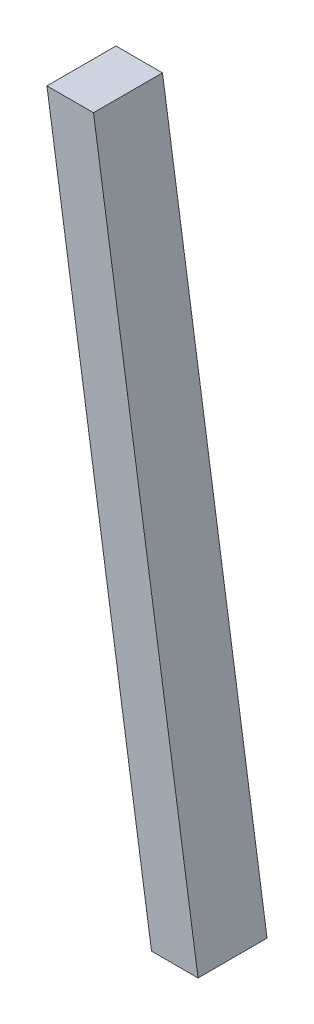
ISO-10303-21;
HEADER;
FILE_DESCRIPTION(('STEP AP214'),'2;1');
FILE_NAME('part.step','',(''),(''),'','','');
FILE_SCHEMA(('AUTOMOTIVE_DESIGN { 1 0 10303 214 1 1 1 1 }'));
ENDSEC;
DATA;
#1=APPLICATION_CONTEXT('core data for automotive mechanical design processes');
#2=APPLICATION_PROTOCOL_DEFINITION('international standard','automotive_design',2000,#1);
#3=PRODUCT_CONTEXT('',#1,'mechanical');
#4=PRODUCT('Part','Part','',(#3));
#5=PRODUCT_RELATED_PRODUCT_CATEGORY('part','',(#4));
#6=PRODUCT_DEFINITION_FORMATION('','',#4);
#7=PRODUCT_DEFINITION_CONTEXT('part definition',#1,'design');
#8=PRODUCT_DEFINITION('design','',#6,#7);
#9=PRODUCT_DEFINITION_SHAPE('','',#8);
#10=(LENGTH_UNIT() NAMED_UNIT(*) SI_UNIT(.MILLI.,.METRE.));
#11=(NAMED_UNIT(*) PLANE_ANGLE_UNIT() SI_UNIT($,.RADIAN.));
#12=(NAMED_UNIT(*) SI_UNIT($,.STERADIAN.) SOLID_ANGLE_UNIT());
#13=UNCERTAINTY_MEASURE_WITH_UNIT(LENGTH_MEASURE(1.E-05),#10,'distance_accuracy_value','');
#14=(GEOMETRIC_REPRESENTATION_CONTEXT(3) GLOBAL_UNCERTAINTY_ASSIGNED_CONTEXT((#13)) GLOBAL_UNIT_ASSIGNED_CONTEXT((#10,
#11,#12)) REPRESENTATION_CONTEXT('',''));
#15=CARTESIAN_POINT('',(0.,0.,0.));
#16=DIRECTION('',(0.,0.,1.));
#17=DIRECTION('',(1.,0.,0.));
#18=AXIS2_PLACEMENT_3D('',#15,#16,#17);
#19=CARTESIAN_POINT('',(140.921638906301,-777.794238257427,60.));
#20=DIRECTION('',(0.988936352868298,0.148340452930245,0.));
#21=DIRECTION('',(-0.148340452930245,0.988936352868298,0.));
#22=AXIS2_PLACEMENT_3D('',#19,#20,#21);
#23=PLANE('',#22);
#24=DIRECTION('',(0.148340452930245,-0.988936352868298,0.));
#25=VECTOR('',#24,1.);
#26=CARTESIAN_POINT('',(140.921638906301,-777.794238257427,0.));
#27=LINE('',#26,#25);
#28=CARTESIAN_POINT('',(24.2525031676866,0.,0.));
#29=VERTEX_POINT('',#28);
#30=CARTESIAN_POINT('',(115.152503167687,-606.,0.));
#31=VERTEX_POINT('',#30);
#32=EDGE_CURVE('E94',#29,#31,#27,.T.);
#33=ORIENTED_EDGE('',*,*,#32,.T.);
#34=DIRECTION('',(0.,0.,-1.));
#35=VECTOR('',#34,1.);
#36=CARTESIAN_POINT('',(115.152503167687,-606.,60.));
#37=LINE('',#36,#35);
#38=CARTESIAN_POINT('',(115.152503167687,-606.,60.));
#39=VERTEX_POINT('',#38);
#40=EDGE_CURVE('E11',#39,#31,#37,.T.);
#41=ORIENTED_EDGE('',*,*,#40,.F.);
#42=DIRECTION('',(0.148340452930245,-0.988936352868298,0.));
#43=VECTOR('',#42,1.);
#44=CARTESIAN_POINT('',(140.921638906301,-777.794238257427,60.));
#45=LINE('',#44,#43);
#46=CARTESIAN_POINT('',(24.2525031676866,0.,60.));
#47=VERTEX_POINT('',#46);
#48=EDGE_CURVE('E80',#47,#39,#45,.T.);
#49=ORIENTED_EDGE('',*,*,#48,.F.);
#50=DIRECTION('',(0.,0.,-1.));
#51=VECTOR('',#50,1.);
#52=CARTESIAN_POINT('',(24.2525031676866,0.,60.));
#53=LINE('',#52,#51);
#54=EDGE_CURVE('E47',#47,#29,#53,.T.);
#55=ORIENTED_EDGE('',*,*,#54,.T.);
#56=EDGE_LOOP('',(#33,#41,#49,#55));
#57=FACE_BOUND('',#56,.T.);
#58=ADVANCED_FACE('F31',(#57),#23,.F.);
#59=CARTESIAN_POINT('',(89.9262515838434,-606.,60.));
#60=DIRECTION('',(0.,1.,0.));
#61=DIRECTION('',(0.,0.,1.));
#62=AXIS2_PLACEMENT_3D('',#59,#60,#61);
#63=PLANE('',#62);
#64=DIRECTION('',(1.,0.,0.));
#65=VECTOR('',#64,1.);
#66=CARTESIAN_POINT('',(89.9262515838434,-606.,0.));
#67=LINE('',#66,#65);
#68=CARTESIAN_POINT('',(155.6,-606.,0.));
#69=VERTEX_POINT('',#68);
#70=EDGE_CURVE('E85',#31,#69,#67,.T.);
#71=ORIENTED_EDGE('',*,*,#70,.T.);
#72=DIRECTION('',(0.,0.,-1.));
#73=VECTOR('',#72,1.);
#74=CARTESIAN_POINT('',(155.6,-606.,60.));
#75=LINE('',#74,#73);
#76=CARTESIAN_POINT('',(155.6,-606.,60.));
#77=VERTEX_POINT('',#76);
#78=EDGE_CURVE('E39',#77,#69,#75,.T.);
#79=ORIENTED_EDGE('',*,*,#78,.F.);
#80=DIRECTION('',(1.,0.,0.));
#81=VECTOR('',#80,1.);
#82=CARTESIAN_POINT('',(89.9262515838434,-606.,60.));
#83=LINE('',#82,#81);
#84=EDGE_CURVE('E72',#39,#77,#83,.T.);
#85=ORIENTED_EDGE('',*,*,#84,.F.);
#86=ORIENTED_EDGE('',*,*,#40,.T.);
#87=EDGE_LOOP('',(#71,#79,#85,#86));
#88=FACE_BOUND('',#87,.T.);
#89=ADVANCED_FACE('F84',(#88),#63,.F.);
#90=CARTESIAN_POINT('',(180.479093021033,-771.860620140217,60.));
#91=DIRECTION('',(0.988936352868297,0.148340452930245,0.));
#92=DIRECTION('',(-0.148340452930245,0.988936352868298,0.));
#93=AXIS2_PLACEMENT_3D('',#90,#91,#92);
#94=PLANE('',#93);
#95=DIRECTION('',(0.148340452930245,-0.988936352868298,0.));
#96=VECTOR('',#95,1.);
#97=CARTESIAN_POINT('',(180.479093021033,-771.860620140217,0.));
#98=LINE('',#97,#96);
#99=CARTESIAN_POINT('',(64.7,0.,0.));
#100=VERTEX_POINT('',#99);
#101=EDGE_CURVE('E97',#100,#69,#98,.T.);
#102=ORIENTED_EDGE('',*,*,#101,.F.);
#103=DIRECTION('',(0.,0.,-1.));
#104=VECTOR('',#103,1.);
#105=CARTESIAN_POINT('',(64.7,0.,60.));
#106=LINE('',#105,#104);
#107=CARTESIAN_POINT('',(64.7,0.,60.));
#108=VERTEX_POINT('',#107);
#109=EDGE_CURVE('E61',#108,#100,#106,.T.);
#110=ORIENTED_EDGE('',*,*,#109,.F.);
#111=DIRECTION('',(0.148340452930245,-0.988936352868298,0.));
#112=VECTOR('',#111,1.);
#113=CARTESIAN_POINT('',(180.479093021033,-771.860620140217,60.));
#114=LINE('',#113,#112);
#115=EDGE_CURVE('E79',#108,#77,#114,.T.);
#116=ORIENTED_EDGE('',*,*,#115,.T.);
#117=ORIENTED_EDGE('',*,*,#78,.T.);
#118=EDGE_LOOP('',(#102,#110,#116,#117));
#119=FACE_BOUND('',#118,.T.);
#120=ADVANCED_FACE('F88',(#119),#94,.T.);
#121=CARTESIAN_POINT('',(89.9262515838434,0.,60.));
#122=DIRECTION('',(0.,1.,0.));
#123=DIRECTION('',(-1.,0.,0.));
#124=AXIS2_PLACEMENT_3D('',#121,#122,#123);
#125=PLANE('',#124);
#126=DIRECTION('',(1.,0.,0.));
#127=VECTOR('',#126,1.);
#128=CARTESIAN_POINT('',(89.9262515838434,0.,0.));
#129=LINE('',#128,#127);
#130=EDGE_CURVE('E99',#29,#100,#129,.T.);
#131=ORIENTED_EDGE('',*,*,#130,.F.);
#132=ORIENTED_EDGE('',*,*,#54,.F.);
#133=DIRECTION('',(1.,0.,0.));
#134=VECTOR('',#133,1.);
#135=CARTESIAN_POINT('',(89.9262515838434,0.,60.));
#136=LINE('',#135,#134);
#137=EDGE_CURVE('E89',#47,#108,#136,.T.);
#138=ORIENTED_EDGE('',*,*,#137,.T.);
#139=ORIENTED_EDGE('',*,*,#109,.T.);
#140=EDGE_LOOP('',(#131,#132,#138,#139));
#141=FACE_BOUND('',#140,.T.);
#142=ADVANCED_FACE('F105',(#141),#125,.T.);
#143=CARTESIAN_POINT('',(89.9262515838434,-785.443546355795,60.));
#144=DIRECTION('',(0.,0.,1.));
#145=DIRECTION('',(1.,0.,0.));
#146=AXIS2_PLACEMENT_3D('',#143,#144,#145);
#147=PLANE('',#146);
#148=ORIENTED_EDGE('',*,*,#48,.T.);
#149=ORIENTED_EDGE('',*,*,#84,.T.);
#150=ORIENTED_EDGE('',*,*,#115,.F.);
#151=ORIENTED_EDGE('',*,*,#137,.F.);
#152=EDGE_LOOP('',(#148,#149,#150,#151));
#153=FACE_BOUND('',#152,.T.);
#154=ADVANCED_FACE('F76',(#153),#147,.T.);
#155=CARTESIAN_POINT('',(89.9262515838434,-785.443546355795,0.));
#156=DIRECTION('',(0.,0.,1.));
#157=DIRECTION('',(1.,0.,0.));
#158=AXIS2_PLACEMENT_3D('',#155,#156,#157);
#159=PLANE('',#158);
#160=ORIENTED_EDGE('',*,*,#32,.F.);
#161=ORIENTED_EDGE('',*,*,#130,.T.);
#162=ORIENTED_EDGE('',*,*,#101,.T.);
#163=ORIENTED_EDGE('',*,*,#70,.F.);
#164=EDGE_LOOP('',(#160,#161,#162,#163));
#165=FACE_BOUND('',#164,.T.);
#166=ADVANCED_FACE('F104',(#165),#159,.F.);
#167=CLOSED_SHELL('',(#58,#89,#120,#142,#154,#166));
#168=MANIFOLD_SOLID_BREP('B2',#167);
#169=ADVANCED_BREP_SHAPE_REPRESENTATION('',(#18,#168),#14);
#170=SHAPE_DEFINITION_REPRESENTATION(#9,#169);
ENDSEC;
END-ISO-10303-21;
